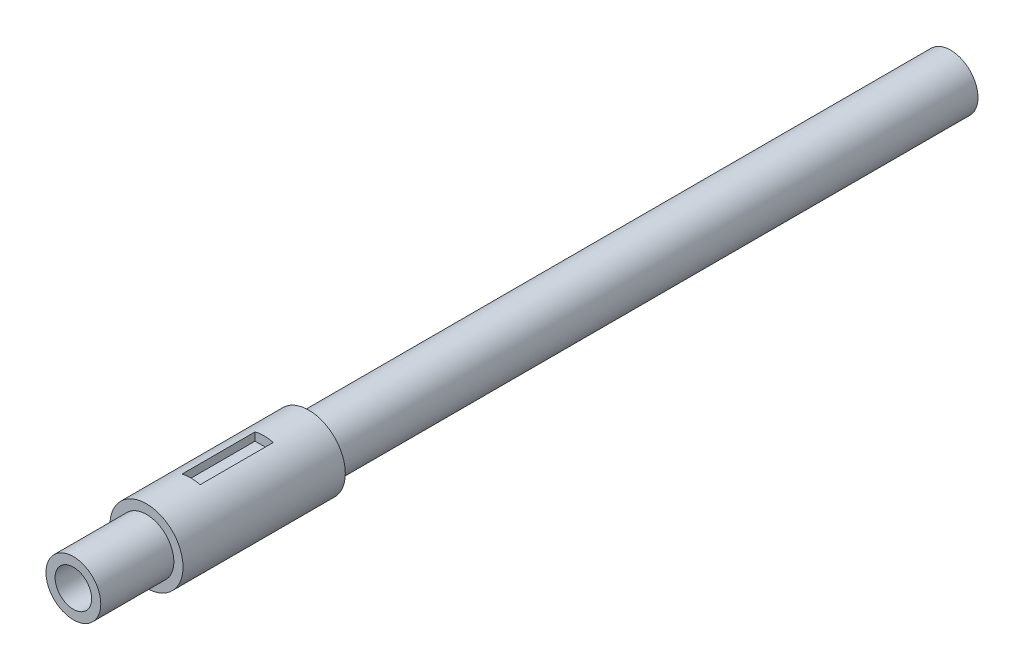
ISO-10303-21;
HEADER;
FILE_DESCRIPTION(('STEP AP214'),'2;1');
FILE_NAME('part.step','',(''),(''),'','','');
FILE_SCHEMA(('AUTOMOTIVE_DESIGN { 1 0 10303 214 1 1 1 1 }'));
ENDSEC;
DATA;
#1=APPLICATION_CONTEXT('core data for automotive mechanical design processes');
#2=APPLICATION_PROTOCOL_DEFINITION('international standard','automotive_design',2000,#1);
#3=PRODUCT_CONTEXT('',#1,'mechanical');
#4=PRODUCT('Part','Part','',(#3));
#5=PRODUCT_RELATED_PRODUCT_CATEGORY('part','',(#4));
#6=PRODUCT_DEFINITION_FORMATION('','',#4);
#7=PRODUCT_DEFINITION_CONTEXT('part definition',#1,'design');
#8=PRODUCT_DEFINITION('design','',#6,#7);
#9=PRODUCT_DEFINITION_SHAPE('','',#8);
#10=(LENGTH_UNIT() NAMED_UNIT(*) SI_UNIT(.MILLI.,.METRE.));
#11=(NAMED_UNIT(*) PLANE_ANGLE_UNIT() SI_UNIT($,.RADIAN.));
#12=(NAMED_UNIT(*) SI_UNIT($,.STERADIAN.) SOLID_ANGLE_UNIT());
#13=UNCERTAINTY_MEASURE_WITH_UNIT(LENGTH_MEASURE(1.E-05),#10,'distance_accuracy_value','');
#14=(GEOMETRIC_REPRESENTATION_CONTEXT(3) GLOBAL_UNCERTAINTY_ASSIGNED_CONTEXT((#13)) GLOBAL_UNIT_ASSIGNED_CONTEXT((#10,
#11,#12)) REPRESENTATION_CONTEXT('',''));
#15=CARTESIAN_POINT('',(0.,0.,0.));
#16=DIRECTION('',(0.,0.,1.));
#17=DIRECTION('',(1.,0.,0.));
#18=AXIS2_PLACEMENT_3D('',#15,#16,#17);
#19=CARTESIAN_POINT('',(0.,0.,-304.8));
#20=DIRECTION('',(0.,0.,1.));
#21=DIRECTION('',(1.,0.,0.));
#22=AXIS2_PLACEMENT_3D('',#19,#20,#21);
#23=CYLINDRICAL_SURFACE('',#22,12.7);
#24=DIRECTION('',(0.,0.,1.));
#25=VECTOR('',#24,1.);
#26=CARTESIAN_POINT('',(-3.175,12.2967221242085,-304.8));
#27=LINE('',#26,#25);
#28=CARTESIAN_POINT('',(-3.175,12.2967221242086,-66.294));
#29=VERTEX_POINT('',#28);
#30=CARTESIAN_POINT('',(-3.175,12.2967221242085,-40.894));
#31=VERTEX_POINT('',#30);
#32=EDGE_CURVE('E43',#29,#31,#27,.T.);
#33=ORIENTED_EDGE('',*,*,#32,.F.);
#34=CARTESIAN_POINT('',(0.,0.,-66.294));
#35=DIRECTION('',(0.,0.,1.));
#36=DIRECTION('',(1.,0.,0.));
#37=AXIS2_PLACEMENT_3D('',#34,#35,#36);
#38=CIRCLE('',#37,12.7);
#39=CARTESIAN_POINT('',(3.175,12.2967221242086,-66.294));
#40=VERTEX_POINT('',#39);
#41=EDGE_CURVE('E11',#29,#40,#38,.F.);
#42=ORIENTED_EDGE('',*,*,#41,.T.);
#43=DIRECTION('',(0.,0.,1.));
#44=VECTOR('',#43,1.);
#45=CARTESIAN_POINT('',(3.175,12.2967221242085,-304.8));
#46=LINE('',#45,#44);
#47=CARTESIAN_POINT('',(3.175,12.2967221242085,-40.894));
#48=VERTEX_POINT('',#47);
#49=EDGE_CURVE('E58',#48,#40,#46,.F.);
#50=ORIENTED_EDGE('',*,*,#49,.F.);
#51=CARTESIAN_POINT('',(0.,0.,-40.894));
#52=DIRECTION('',(0.,0.,1.));
#53=DIRECTION('',(1.,0.,0.));
#54=AXIS2_PLACEMENT_3D('',#51,#52,#53);
#55=CIRCLE('',#54,12.7);
#56=EDGE_CURVE('E113',#31,#48,#55,.F.);
#57=ORIENTED_EDGE('',*,*,#56,.F.);
#58=EDGE_LOOP('',(#33,#42,#50,#57));
#59=FACE_BOUND('',#58,.T.);
#60=CARTESIAN_POINT('',(0.,0.,-81.788));
#61=DIRECTION('',(0.,0.,1.));
#62=DIRECTION('',(1.,0.,0.));
#63=AXIS2_PLACEMENT_3D('',#60,#61,#62);
#64=CIRCLE('',#63,12.7);
#65=CARTESIAN_POINT('',(12.7,0.,-81.788));
#66=VERTEX_POINT('',#65);
#67=EDGE_CURVE('E117',#66,#66,#64,.F.);
#68=ORIENTED_EDGE('',*,*,#67,.F.);
#69=EDGE_LOOP('',(#68));
#70=FACE_BOUND('',#69,.T.);
#71=CARTESIAN_POINT('',(0.,0.,-25.4));
#72=DIRECTION('',(0.,0.,1.));
#73=DIRECTION('',(1.,0.,0.));
#74=AXIS2_PLACEMENT_3D('',#71,#72,#73);
#75=CIRCLE('',#74,12.7);
#76=CARTESIAN_POINT('',(12.7,0.,-25.4));
#77=VERTEX_POINT('',#76);
#78=EDGE_CURVE('E38',#77,#77,#75,.F.);
#79=ORIENTED_EDGE('',*,*,#78,.T.);
#80=EDGE_LOOP('',(#79));
#81=FACE_BOUND('',#80,.T.);
#82=ADVANCED_FACE('F35',(#59,#70,#81),#23,.T.);
#83=CARTESIAN_POINT('',(0.,0.,0.));
#84=DIRECTION('',(0.,0.,1.));
#85=DIRECTION('',(1.,0.,0.));
#86=AXIS2_PLACEMENT_3D('',#83,#84,#85);
#87=PLANE('',#86);
#88=CARTESIAN_POINT('',(0.,0.,0.));
#89=DIRECTION('',(0.,0.,1.));
#90=DIRECTION('',(1.,0.,0.));
#91=AXIS2_PLACEMENT_3D('',#88,#89,#90);
#92=CIRCLE('',#91,6.35);
#93=CARTESIAN_POINT('',(6.35,0.,0.));
#94=VERTEX_POINT('',#93);
#95=EDGE_CURVE('E114',#94,#94,#92,.T.);
#96=ORIENTED_EDGE('',*,*,#95,.F.);
#97=EDGE_LOOP('',(#96));
#98=FACE_BOUND('',#97,.T.);
#99=CARTESIAN_POINT('',(0.,0.,0.));
#100=DIRECTION('',(0.,0.,1.));
#101=DIRECTION('',(1.,0.,0.));
#102=AXIS2_PLACEMENT_3D('',#99,#100,#101);
#103=CIRCLE('',#102,9.525);
#104=CARTESIAN_POINT('',(9.525,0.,0.));
#105=VERTEX_POINT('',#104);
#106=EDGE_CURVE('E247',#105,#105,#103,.T.);
#107=ORIENTED_EDGE('',*,*,#106,.T.);
#108=EDGE_LOOP('',(#107));
#109=FACE_BOUND('',#108,.T.);
#110=ADVANCED_FACE('F139',(#98,#109),#87,.T.);
#111=CARTESIAN_POINT('',(0.,0.,-304.8));
#112=DIRECTION('',(0.,0.,1.));
#113=DIRECTION('',(1.,0.,0.));
#114=AXIS2_PLACEMENT_3D('',#111,#112,#113);
#115=PLANE('',#114);
#116=CARTESIAN_POINT('',(0.,0.,-304.8));
#117=DIRECTION('',(0.,0.,1.));
#118=DIRECTION('',(1.,0.,0.));
#119=AXIS2_PLACEMENT_3D('',#116,#117,#118);
#120=CIRCLE('',#119,6.35);
#121=CARTESIAN_POINT('',(6.35,0.,-304.8));
#122=VERTEX_POINT('',#121);
#123=EDGE_CURVE('E110',#122,#122,#120,.T.);
#124=ORIENTED_EDGE('',*,*,#123,.T.);
#125=EDGE_LOOP('',(#124));
#126=FACE_BOUND('',#125,.T.);
#127=CARTESIAN_POINT('',(0.,0.,-304.8));
#128=DIRECTION('',(0.,0.,1.));
#129=DIRECTION('',(1.,0.,0.));
#130=AXIS2_PLACEMENT_3D('',#127,#128,#129);
#131=CIRCLE('',#130,9.525);
#132=CARTESIAN_POINT('',(9.525,0.,-304.8));
#133=VERTEX_POINT('',#132);
#134=EDGE_CURVE('E109',#133,#133,#131,.T.);
#135=ORIENTED_EDGE('',*,*,#134,.F.);
#136=EDGE_LOOP('',(#135));
#137=FACE_BOUND('',#136,.T.);
#138=ADVANCED_FACE('F143',(#126,#137),#115,.F.);
#139=CARTESIAN_POINT('',(0.,0.,-304.8));
#140=DIRECTION('',(0.,0.,1.));
#141=DIRECTION('',(1.,0.,0.));
#142=AXIS2_PLACEMENT_3D('',#139,#140,#141);
#143=CYLINDRICAL_SURFACE('',#142,6.35);
#144=CARTESIAN_POINT('',(6.35,0.,-304.8));
#145=CARTESIAN_POINT('',(6.35,0.,-301.625));
#146=CARTESIAN_POINT('',(6.35,0.,-298.45));
#147=CARTESIAN_POINT('',(6.35,0.,-292.1));
#148=CARTESIAN_POINT('',(6.35,0.,-288.925));
#149=CARTESIAN_POINT('',(6.35,0.,-282.575));
#150=CARTESIAN_POINT('',(6.35,0.,-279.4));
#151=CARTESIAN_POINT('',(6.35,0.,-273.05));
#152=CARTESIAN_POINT('',(6.35,0.,-269.875));
#153=CARTESIAN_POINT('',(6.35,0.,-263.525));
#154=CARTESIAN_POINT('',(6.35,0.,-260.35));
#155=CARTESIAN_POINT('',(6.35,0.,-254.));
#156=CARTESIAN_POINT('',(6.35,0.,-250.825));
#157=CARTESIAN_POINT('',(6.35,0.,-244.475));
#158=CARTESIAN_POINT('',(6.35,0.,-241.3));
#159=CARTESIAN_POINT('',(6.35,0.,-234.95));
#160=CARTESIAN_POINT('',(6.35,0.,-231.775));
#161=CARTESIAN_POINT('',(6.35,0.,-225.425));
#162=CARTESIAN_POINT('',(6.35,0.,-222.25));
#163=CARTESIAN_POINT('',(6.35,0.,-215.9));
#164=CARTESIAN_POINT('',(6.35,0.,-212.725));
#165=CARTESIAN_POINT('',(6.35,0.,-206.375));
#166=CARTESIAN_POINT('',(6.35,0.,-203.2));
#167=CARTESIAN_POINT('',(6.35,0.,-196.85));
#168=CARTESIAN_POINT('',(6.35,0.,-193.675));
#169=CARTESIAN_POINT('',(6.35,0.,-187.325));
#170=CARTESIAN_POINT('',(6.35,0.,-184.15));
#171=CARTESIAN_POINT('',(6.35,0.,-177.8));
#172=CARTESIAN_POINT('',(6.35,0.,-174.625));
#173=CARTESIAN_POINT('',(6.35,0.,-168.275));
#174=CARTESIAN_POINT('',(6.35,0.,-165.1));
#175=CARTESIAN_POINT('',(6.35,0.,-158.75));
#176=CARTESIAN_POINT('',(6.35,0.,-155.575));
#177=CARTESIAN_POINT('',(6.35,0.,-149.225));
#178=CARTESIAN_POINT('',(6.35,0.,-146.05));
#179=CARTESIAN_POINT('',(6.35,0.,-139.7));
#180=CARTESIAN_POINT('',(6.35,0.,-136.525));
#181=CARTESIAN_POINT('',(6.35,0.,-130.175));
#182=CARTESIAN_POINT('',(6.35,0.,-127.));
#183=CARTESIAN_POINT('',(6.35,0.,-120.65));
#184=CARTESIAN_POINT('',(6.35,0.,-117.475));
#185=CARTESIAN_POINT('',(6.35,0.,-111.125));
#186=CARTESIAN_POINT('',(6.35,0.,-107.95));
#187=CARTESIAN_POINT('',(6.35,0.,-101.6));
#188=CARTESIAN_POINT('',(6.35,0.,-98.425));
#189=CARTESIAN_POINT('',(6.35,0.,-92.075));
#190=CARTESIAN_POINT('',(6.35,0.,-88.9));
#191=CARTESIAN_POINT('',(6.35,0.,-82.55));
#192=CARTESIAN_POINT('',(6.35,0.,-79.375));
#193=CARTESIAN_POINT('',(6.35,0.,-73.025));
#194=CARTESIAN_POINT('',(6.35,0.,-69.85));
#195=CARTESIAN_POINT('',(6.35,0.,-63.5));
#196=CARTESIAN_POINT('',(6.35,0.,-60.325));
#197=CARTESIAN_POINT('',(6.35,0.,-53.975));
#198=CARTESIAN_POINT('',(6.35,0.,-50.8));
#199=CARTESIAN_POINT('',(6.35,0.,-44.45));
#200=CARTESIAN_POINT('',(6.35,0.,-41.275));
#201=CARTESIAN_POINT('',(6.35,0.,-34.925));
#202=CARTESIAN_POINT('',(6.35,0.,-31.75));
#203=CARTESIAN_POINT('',(6.35,0.,-25.4));
#204=CARTESIAN_POINT('',(6.35,0.,-22.225));
#205=CARTESIAN_POINT('',(6.35,0.,-15.875));
#206=CARTESIAN_POINT('',(6.35,0.,-12.7));
#207=CARTESIAN_POINT('',(6.35,0.,-6.35));
#208=CARTESIAN_POINT('',(6.35,0.,-3.175));
#209=CARTESIAN_POINT('',(6.35,0.,0.));
#210=B_SPLINE_CURVE_WITH_KNOTS('',3,(#144,#145,#146,#147,#148,#149,#150,#151,#152,#153,#154,
#155,#156,#157,#158,#159,#160,#161,#162,#163,#164,#165,#166,#167,#168,#169,#170,#171,#172,#173,
#174,#175,#176,#177,#178,#179,#180,#181,#182,#183,#184,#185,#186,#187,#188,#189,#190,#191,#192,
#193,#194,#195,#196,#197,#198,#199,#200,#201,#202,#203,#204,#205,#206,#207,#208,#209),
.UNSPECIFIED.,.F.,.F.,(4,2,2,2,2,2,2,2,2,2,2,2,2,2,2,2,2,2,2,2,2,2,2,2,2,2,2,2,2,2,2,2,4),(0.,
9.52500000000001,19.05,28.575,38.1,47.625,57.15,66.675,76.2,85.7250000000001,95.2500000000001,
104.775,114.3,123.825,133.35,142.875,152.4,161.925,171.45,180.975,190.5,200.025,209.55,219.075,
228.6,238.125,247.65,257.175,266.7,276.225,285.75,295.275,304.8),.UNSPECIFIED.);
#211=EDGE_CURVE('BSEAM148',#122,#94,#210,.T.);
#212=ORIENTED_EDGE('',*,*,#123,.F.);
#213=ORIENTED_EDGE('',*,*,#95,.T.);
#214=ORIENTED_EDGE('',*,*,#211,.T.);
#215=ORIENTED_EDGE('',*,*,#211,.F.);
#216=EDGE_LOOP('',(#212,#214,#213,#215));
#217=FACE_BOUND('',#216,.T.);
#218=ADVANCED_FACE('F148',(#217),#143,.F.);
#219=CARTESIAN_POINT('',(0.,0.,-335.788));
#220=DIRECTION('',(0.,0.,1.));
#221=DIRECTION('',(1.,0.,0.));
#222=AXIS2_PLACEMENT_3D('',#219,#220,#221);
#223=CYLINDRICAL_SURFACE('',#222,9.525);
#224=CARTESIAN_POINT('',(0.,0.,-81.788));
#225=DIRECTION('',(0.,0.,1.));
#226=DIRECTION('',(1.,0.,0.));
#227=AXIS2_PLACEMENT_3D('',#224,#225,#226);
#228=CIRCLE('',#227,9.525);
#229=CARTESIAN_POINT('',(9.525,0.,-81.788));
#230=VERTEX_POINT('',#229);
#231=EDGE_CURVE('E105',#230,#230,#228,.T.);
#232=ORIENTED_EDGE('',*,*,#231,.F.);
#233=EDGE_LOOP('',(#232));
#234=FACE_BOUND('',#233,.T.);
#235=ORIENTED_EDGE('',*,*,#134,.T.);
#236=EDGE_LOOP('',(#235));
#237=FACE_BOUND('',#236,.T.);
#238=ADVANCED_FACE('F156',(#234,#237),#223,.T.);
#239=CARTESIAN_POINT('',(0.,0.,-81.788));
#240=DIRECTION('',(0.,0.,1.));
#241=DIRECTION('',(1.,0.,0.));
#242=AXIS2_PLACEMENT_3D('',#239,#240,#241);
#243=PLANE('',#242);
#244=ORIENTED_EDGE('',*,*,#67,.T.);
#245=EDGE_LOOP('',(#244));
#246=FACE_BOUND('',#245,.T.);
#247=ORIENTED_EDGE('',*,*,#231,.T.);
#248=EDGE_LOOP('',(#247));
#249=FACE_BOUND('',#248,.T.);
#250=ADVANCED_FACE('F136',(#246,#249),#243,.F.);
#251=CARTESIAN_POINT('',(-3.175,12.2967221242085,-66.294));
#252=DIRECTION('',(-1.,0.,0.));
#253=DIRECTION('',(0.,-1.,0.));
#254=AXIS2_PLACEMENT_3D('',#251,#252,#253);
#255=PLANE('',#254);
#256=ORIENTED_EDGE('',*,*,#32,.T.);
#257=DIRECTION('',(0.,-1.,0.));
#258=VECTOR('',#257,1.);
#259=CARTESIAN_POINT('',(-3.175,12.2967221242085,-40.894));
#260=LINE('',#259,#258);
#261=CARTESIAN_POINT('',(-3.175,9.50272212420855,-40.894));
#262=VERTEX_POINT('',#261);
#263=EDGE_CURVE('E50',#31,#262,#260,.T.);
#264=ORIENTED_EDGE('',*,*,#263,.T.);
#265=DIRECTION('',(0.,0.,1.));
#266=VECTOR('',#265,1.);
#267=CARTESIAN_POINT('',(-3.175,9.50272212420855,-66.294));
#268=LINE('',#267,#266);
#269=CARTESIAN_POINT('',(-3.175,9.50272212420855,-66.294));
#270=VERTEX_POINT('',#269);
#271=EDGE_CURVE('E87',#270,#262,#268,.T.);
#272=ORIENTED_EDGE('',*,*,#271,.F.);
#273=DIRECTION('',(0.,-1.,0.));
#274=VECTOR('',#273,1.);
#275=CARTESIAN_POINT('',(-3.175,12.2967221242085,-66.294));
#276=LINE('',#275,#274);
#277=EDGE_CURVE('E78',#29,#270,#276,.T.);
#278=ORIENTED_EDGE('',*,*,#277,.F.);
#279=EDGE_LOOP('',(#256,#264,#272,#278));
#280=FACE_BOUND('',#279,.T.);
#281=ADVANCED_FACE('F88',(#280),#255,.F.);
#282=CARTESIAN_POINT('',(3.175,15.8527221242085,-66.294));
#283=DIRECTION('',(1.,0.,0.));
#284=DIRECTION('',(0.,1.,0.));
#285=AXIS2_PLACEMENT_3D('',#282,#283,#284);
#286=PLANE('',#285);
#287=ORIENTED_EDGE('',*,*,#49,.T.);
#288=DIRECTION('',(0.,1.,0.));
#289=VECTOR('',#288,1.);
#290=CARTESIAN_POINT('',(3.175,9.50272212420855,-66.294));
#291=LINE('',#290,#289);
#292=CARTESIAN_POINT('',(3.175,9.50272212420855,-66.294));
#293=VERTEX_POINT('',#292);
#294=EDGE_CURVE('E92',#293,#40,#291,.T.);
#295=ORIENTED_EDGE('',*,*,#294,.F.);
#296=DIRECTION('',(0.,0.,1.));
#297=VECTOR('',#296,1.);
#298=CARTESIAN_POINT('',(3.175,9.50272212420855,-66.294));
#299=LINE('',#298,#297);
#300=CARTESIAN_POINT('',(3.175,9.50272212420855,-40.894));
#301=VERTEX_POINT('',#300);
#302=EDGE_CURVE('E91',#293,#301,#299,.T.);
#303=ORIENTED_EDGE('',*,*,#302,.T.);
#304=DIRECTION('',(0.,1.,0.));
#305=VECTOR('',#304,1.);
#306=CARTESIAN_POINT('',(3.175,15.8527221242085,-40.894));
#307=LINE('',#306,#305);
#308=EDGE_CURVE('E102',#301,#48,#307,.T.);
#309=ORIENTED_EDGE('',*,*,#308,.T.);
#310=EDGE_LOOP('',(#287,#295,#303,#309));
#311=FACE_BOUND('',#310,.T.);
#312=ADVANCED_FACE('F128',(#311),#286,.F.);
#313=CARTESIAN_POINT('',(-3.175,9.50272212420855,-66.294));
#314=DIRECTION('',(0.,-1.,0.));
#315=DIRECTION('',(0.,0.,-1.));
#316=AXIS2_PLACEMENT_3D('',#313,#314,#315);
#317=PLANE('',#316);
#318=DIRECTION('',(1.,0.,0.));
#319=VECTOR('',#318,1.);
#320=CARTESIAN_POINT('',(-3.175,9.50272212420855,-40.894));
#321=LINE('',#320,#319);
#322=EDGE_CURVE('E100',#262,#301,#321,.T.);
#323=ORIENTED_EDGE('',*,*,#322,.T.);
#324=ORIENTED_EDGE('',*,*,#302,.F.);
#325=DIRECTION('',(1.,0.,0.));
#326=VECTOR('',#325,1.);
#327=CARTESIAN_POINT('',(-3.175,9.50272212420855,-66.294));
#328=LINE('',#327,#326);
#329=EDGE_CURVE('E82',#270,#293,#328,.T.);
#330=ORIENTED_EDGE('',*,*,#329,.F.);
#331=ORIENTED_EDGE('',*,*,#271,.T.);
#332=EDGE_LOOP('',(#323,#324,#330,#331));
#333=FACE_BOUND('',#332,.T.);
#334=ADVANCED_FACE('F94',(#333),#317,.F.);
#335=CARTESIAN_POINT('',(0.,0.,-66.294));
#336=DIRECTION('',(0.,0.,1.));
#337=DIRECTION('',(1.,0.,0.));
#338=AXIS2_PLACEMENT_3D('',#335,#336,#337);
#339=PLANE('',#338);
#340=ORIENTED_EDGE('',*,*,#277,.T.);
#341=ORIENTED_EDGE('',*,*,#329,.T.);
#342=ORIENTED_EDGE('',*,*,#294,.T.);
#343=ORIENTED_EDGE('',*,*,#41,.F.);
#344=EDGE_LOOP('',(#340,#341,#342,#343));
#345=FACE_BOUND('',#344,.T.);
#346=ADVANCED_FACE('F80',(#345),#339,.T.);
#347=CARTESIAN_POINT('',(0.,0.,-40.894));
#348=DIRECTION('',(0.,0.,1.));
#349=DIRECTION('',(1.,0.,0.));
#350=AXIS2_PLACEMENT_3D('',#347,#348,#349);
#351=PLANE('',#350);
#352=ORIENTED_EDGE('',*,*,#56,.T.);
#353=ORIENTED_EDGE('',*,*,#308,.F.);
#354=ORIENTED_EDGE('',*,*,#322,.F.);
#355=ORIENTED_EDGE('',*,*,#263,.F.);
#356=EDGE_LOOP('',(#352,#353,#354,#355));
#357=FACE_BOUND('',#356,.T.);
#358=ADVANCED_FACE('F127',(#357),#351,.F.);
#359=CARTESIAN_POINT('',(0.,0.,-79.2815367264149));
#360=DIRECTION('',(0.,0.,1.));
#361=DIRECTION('',(1.,0.,0.));
#362=AXIS2_PLACEMENT_3D('',#359,#360,#361);
#363=CYLINDRICAL_SURFACE('',#362,9.525);
#364=CARTESIAN_POINT('',(0.,0.,-25.4));
#365=DIRECTION('',(0.,0.,1.));
#366=DIRECTION('',(1.,0.,0.));
#367=AXIS2_PLACEMENT_3D('',#364,#365,#366);
#368=CIRCLE('',#367,9.525);
#369=CARTESIAN_POINT('',(9.525,0.,-25.4));
#370=VERTEX_POINT('',#369);
#371=EDGE_CURVE('E246',#370,#370,#368,.F.);
#372=ORIENTED_EDGE('',*,*,#371,.F.);
#373=EDGE_LOOP('',(#372));
#374=FACE_BOUND('',#373,.T.);
#375=ORIENTED_EDGE('',*,*,#106,.F.);
#376=EDGE_LOOP('',(#375));
#377=FACE_BOUND('',#376,.T.);
#378=ADVANCED_FACE('F209',(#374,#377),#363,.T.);
#379=CARTESIAN_POINT('',(0.,0.,-25.4));
#380=DIRECTION('',(0.,0.,1.));
#381=DIRECTION('',(1.,0.,0.));
#382=AXIS2_PLACEMENT_3D('',#379,#380,#381);
#383=PLANE('',#382);
#384=ORIENTED_EDGE('',*,*,#78,.F.);
#385=EDGE_LOOP('',(#384));
#386=FACE_BOUND('',#385,.T.);
#387=ORIENTED_EDGE('',*,*,#371,.T.);
#388=EDGE_LOOP('',(#387));
#389=FACE_BOUND('',#388,.T.);
#390=ADVANCED_FACE('F227',(#386,#389),#383,.T.);
#391=CLOSED_SHELL('',(#82,#110,#138,#218,#238,#250,#281,#312,#334,#346,#358,#378,#390));
#392=MANIFOLD_SOLID_BREP('B2',#391);
#393=ADVANCED_BREP_SHAPE_REPRESENTATION('',(#18,#392),#14);
#394=SHAPE_DEFINITION_REPRESENTATION(#9,#393);
ENDSEC;
END-ISO-10303-21;
